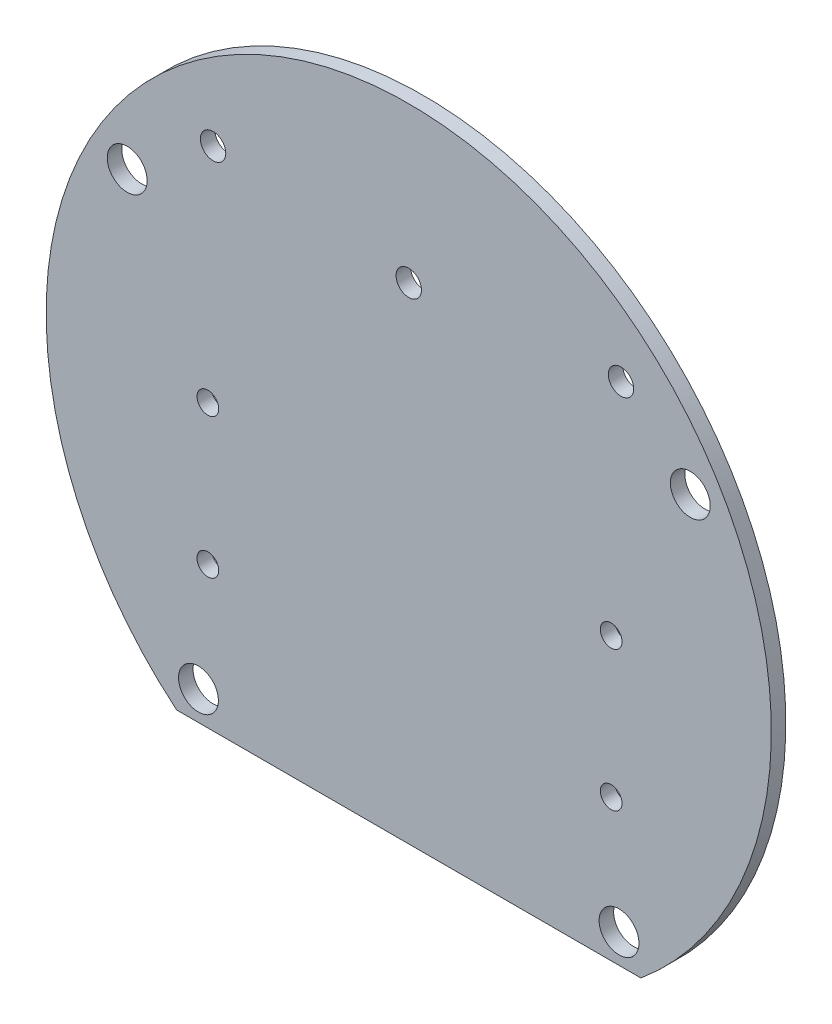
ISO-10303-21;
HEADER;
FILE_DESCRIPTION(('STEP AP214'),'2;1');
FILE_NAME('part.step','',(''),(''),'','','');
FILE_SCHEMA(('AUTOMOTIVE_DESIGN { 1 0 10303 214 1 1 1 1 }'));
ENDSEC;
DATA;
#1=APPLICATION_CONTEXT('core data for automotive mechanical design processes');
#2=APPLICATION_PROTOCOL_DEFINITION('international standard','automotive_design',2000,#1);
#3=PRODUCT_CONTEXT('',#1,'mechanical');
#4=PRODUCT('Part','Part','',(#3));
#5=PRODUCT_RELATED_PRODUCT_CATEGORY('part','',(#4));
#6=PRODUCT_DEFINITION_FORMATION('','',#4);
#7=PRODUCT_DEFINITION_CONTEXT('part definition',#1,'design');
#8=PRODUCT_DEFINITION('design','',#6,#7);
#9=PRODUCT_DEFINITION_SHAPE('','',#8);
#10=(LENGTH_UNIT() NAMED_UNIT(*) SI_UNIT(.MILLI.,.METRE.));
#11=(NAMED_UNIT(*) PLANE_ANGLE_UNIT() SI_UNIT($,.RADIAN.));
#12=(NAMED_UNIT(*) SI_UNIT($,.STERADIAN.) SOLID_ANGLE_UNIT());
#13=UNCERTAINTY_MEASURE_WITH_UNIT(LENGTH_MEASURE(1.E-05),#10,'distance_accuracy_value','');
#14=(GEOMETRIC_REPRESENTATION_CONTEXT(3) GLOBAL_UNCERTAINTY_ASSIGNED_CONTEXT((#13)) GLOBAL_UNIT_ASSIGNED_CONTEXT((#10,
#11,#12)) REPRESENTATION_CONTEXT('',''));
#15=CARTESIAN_POINT('',(0.,0.,0.));
#16=DIRECTION('',(0.,0.,1.));
#17=DIRECTION('',(1.,0.,0.));
#18=AXIS2_PLACEMENT_3D('',#15,#16,#17);
#19=CARTESIAN_POINT('',(0.,0.,2.));
#20=DIRECTION('',(0.,0.,-1.));
#21=DIRECTION('',(-1.,0.,0.));
#22=AXIS2_PLACEMENT_3D('',#19,#20,#21);
#23=CYLINDRICAL_SURFACE('',#22,50.);
#24=DIRECTION('',(0.,0.,-1.));
#25=VECTOR('',#24,1.);
#26=CARTESIAN_POINT('',(-32.0113353588168,-38.4093010681705,2.));
#27=LINE('',#26,#25);
#28=CARTESIAN_POINT('',(-32.0113353588168,-38.4093010681705,2.));
#29=VERTEX_POINT('',#28);
#30=CARTESIAN_POINT('',(-32.0113353588168,-38.4093010681705,0.));
#31=VERTEX_POINT('',#30);
#32=EDGE_CURVE('E55',#29,#31,#27,.T.);
#33=ORIENTED_EDGE('',*,*,#32,.F.);
#34=CARTESIAN_POINT('',(0.,0.,2.));
#35=DIRECTION('',(0.,0.,1.));
#36=DIRECTION('',(1.,0.,0.));
#37=AXIS2_PLACEMENT_3D('',#34,#35,#36);
#38=CIRCLE('',#37,50.);
#39=CARTESIAN_POINT('',(32.0113353588168,-38.4093010681705,2.));
#40=VERTEX_POINT('',#39);
#41=EDGE_CURVE('E49',#40,#29,#38,.T.);
#42=ORIENTED_EDGE('',*,*,#41,.F.);
#43=DIRECTION('',(0.,0.,-1.));
#44=VECTOR('',#43,1.);
#45=CARTESIAN_POINT('',(32.0113353588168,-38.4093010681705,2.));
#46=LINE('',#45,#44);
#47=CARTESIAN_POINT('',(32.0113353588168,-38.4093010681705,0.));
#48=VERTEX_POINT('',#47);
#49=EDGE_CURVE('E66',#48,#40,#46,.F.);
#50=ORIENTED_EDGE('',*,*,#49,.F.);
#51=CARTESIAN_POINT('',(0.,0.,0.));
#52=DIRECTION('',(0.,0.,1.));
#53=DIRECTION('',(1.,0.,0.));
#54=AXIS2_PLACEMENT_3D('',#51,#52,#53);
#55=CIRCLE('',#54,50.);
#56=EDGE_CURVE('E72',#48,#31,#55,.T.);
#57=ORIENTED_EDGE('',*,*,#56,.T.);
#58=EDGE_LOOP('',(#33,#42,#50,#57));
#59=FACE_BOUND('',#58,.T.);
#60=ADVANCED_FACE('F41',(#59),#23,.T.);
#61=CARTESIAN_POINT('',(0.,0.,2.));
#62=DIRECTION('',(0.,0.,1.));
#63=DIRECTION('',(1.,0.,0.));
#64=AXIS2_PLACEMENT_3D('',#61,#62,#63);
#65=PLANE('',#64);
#66=CARTESIAN_POINT('',(29.27,31.44,2.));
#67=DIRECTION('',(0.,0.,1.));
#68=DIRECTION('',(1.,0.,0.));
#69=AXIS2_PLACEMENT_3D('',#66,#67,#68);
#70=CIRCLE('',#69,1.75);
#71=CARTESIAN_POINT('',(31.02,31.44,2.));
#72=VERTEX_POINT('',#71);
#73=EDGE_CURVE('E75',#72,#72,#70,.T.);
#74=ORIENTED_EDGE('',*,*,#73,.F.);
#75=EDGE_LOOP('',(#74));
#76=FACE_BOUND('',#75,.T.);
#77=CARTESIAN_POINT('',(-26.98,31.44,2.));
#78=DIRECTION('',(0.,0.,1.));
#79=DIRECTION('',(1.,0.,0.));
#80=AXIS2_PLACEMENT_3D('',#77,#78,#79);
#81=CIRCLE('',#80,1.75);
#82=CARTESIAN_POINT('',(-25.23,31.44,2.));
#83=VERTEX_POINT('',#82);
#84=EDGE_CURVE('E121',#83,#83,#81,.T.);
#85=ORIENTED_EDGE('',*,*,#84,.F.);
#86=EDGE_LOOP('',(#85));
#87=FACE_BOUND('',#86,.T.);
#88=CARTESIAN_POINT('',(27.91,0.439999999999989,2.));
#89=DIRECTION('',(0.,0.,1.));
#90=DIRECTION('',(1.,0.,0.));
#91=AXIS2_PLACEMENT_3D('',#88,#89,#90);
#92=CIRCLE('',#91,1.5);
#93=CARTESIAN_POINT('',(29.41,0.439999999999989,2.));
#94=VERTEX_POINT('',#93);
#95=EDGE_CURVE('E125',#94,#94,#92,.T.);
#96=ORIENTED_EDGE('',*,*,#95,.F.);
#97=EDGE_LOOP('',(#96));
#98=FACE_BOUND('',#97,.T.);
#99=CARTESIAN_POINT('',(-27.7,0.439999999999996,2.));
#100=DIRECTION('',(0.,0.,1.));
#101=DIRECTION('',(1.,0.,0.));
#102=AXIS2_PLACEMENT_3D('',#99,#100,#101);
#103=CIRCLE('',#102,1.5);
#104=CARTESIAN_POINT('',(-26.2,0.439999999999996,2.));
#105=VERTEX_POINT('',#104);
#106=EDGE_CURVE('E129',#105,#105,#103,.T.);
#107=ORIENTED_EDGE('',*,*,#106,.F.);
#108=EDGE_LOOP('',(#107));
#109=FACE_BOUND('',#108,.T.);
#110=CARTESIAN_POINT('',(-27.7,-18.86,2.));
#111=DIRECTION('',(0.,0.,1.));
#112=DIRECTION('',(1.,0.,0.));
#113=AXIS2_PLACEMENT_3D('',#110,#111,#112);
#114=CIRCLE('',#113,1.5);
#115=CARTESIAN_POINT('',(-26.2,-18.86,2.));
#116=VERTEX_POINT('',#115);
#117=EDGE_CURVE('E133',#116,#116,#114,.T.);
#118=ORIENTED_EDGE('',*,*,#117,.F.);
#119=EDGE_LOOP('',(#118));
#120=FACE_BOUND('',#119,.T.);
#121=CARTESIAN_POINT('',(27.91,-18.86,2.));
#122=DIRECTION('',(0.,0.,1.));
#123=DIRECTION('',(1.,0.,0.));
#124=AXIS2_PLACEMENT_3D('',#121,#122,#123);
#125=CIRCLE('',#124,1.5);
#126=CARTESIAN_POINT('',(29.41,-18.86,2.));
#127=VERTEX_POINT('',#126);
#128=EDGE_CURVE('E137',#127,#127,#125,.T.);
#129=ORIENTED_EDGE('',*,*,#128,.F.);
#130=EDGE_LOOP('',(#129));
#131=FACE_BOUND('',#130,.T.);
#132=CARTESIAN_POINT('',(0.,28.6,2.));
#133=DIRECTION('',(0.,0.,1.));
#134=DIRECTION('',(1.,0.,0.));
#135=AXIS2_PLACEMENT_3D('',#132,#133,#134);
#136=CIRCLE('',#135,1.75);
#137=CARTESIAN_POINT('',(1.75,28.6,2.));
#138=VERTEX_POINT('',#137);
#139=EDGE_CURVE('E141',#138,#138,#136,.T.);
#140=ORIENTED_EDGE('',*,*,#139,.F.);
#141=EDGE_LOOP('',(#140));
#142=FACE_BOUND('',#141,.T.);
#143=CARTESIAN_POINT('',(38.8241975308642,22.7526193235952,2.));
#144=DIRECTION('',(0.,0.,1.));
#145=DIRECTION('',(1.,0.,0.));
#146=AXIS2_PLACEMENT_3D('',#143,#144,#145);
#147=CIRCLE('',#146,2.75);
#148=CARTESIAN_POINT('',(41.5741975308642,22.7526193235952,2.));
#149=VERTEX_POINT('',#148);
#150=EDGE_CURVE('E91',#149,#149,#147,.T.);
#151=ORIENTED_EDGE('',*,*,#150,.F.);
#152=EDGE_LOOP('',(#151));
#153=FACE_BOUND('',#152,.T.);
#154=CARTESIAN_POINT('',(-38.8241975308642,22.7526193235952,2.));
#155=DIRECTION('',(0.,0.,1.));
#156=DIRECTION('',(1.,0.,0.));
#157=AXIS2_PLACEMENT_3D('',#154,#155,#156);
#158=CIRCLE('',#157,2.75);
#159=CARTESIAN_POINT('',(-36.0741975308642,22.7526193235952,2.));
#160=VERTEX_POINT('',#159);
#161=EDGE_CURVE('E99',#160,#160,#158,.T.);
#162=ORIENTED_EDGE('',*,*,#161,.F.);
#163=EDGE_LOOP('',(#162));
#164=FACE_BOUND('',#163,.T.);
#165=CARTESIAN_POINT('',(29.,-34.4093010681705,2.));
#166=DIRECTION('',(0.,0.,1.));
#167=DIRECTION('',(1.,0.,0.));
#168=AXIS2_PLACEMENT_3D('',#165,#166,#167);
#169=CIRCLE('',#168,2.75);
#170=CARTESIAN_POINT('',(31.75,-34.4093010681705,2.));
#171=VERTEX_POINT('',#170);
#172=EDGE_CURVE('E107',#171,#171,#169,.T.);
#173=ORIENTED_EDGE('',*,*,#172,.F.);
#174=EDGE_LOOP('',(#173));
#175=FACE_BOUND('',#174,.T.);
#176=CARTESIAN_POINT('',(-29.,-34.4093010681705,2.));
#177=DIRECTION('',(0.,0.,1.));
#178=DIRECTION('',(1.,0.,0.));
#179=AXIS2_PLACEMENT_3D('',#176,#177,#178);
#180=CIRCLE('',#179,2.75);
#181=CARTESIAN_POINT('',(-26.25,-34.4093010681705,2.));
#182=VERTEX_POINT('',#181);
#183=EDGE_CURVE('E84',#182,#182,#180,.T.);
#184=ORIENTED_EDGE('',*,*,#183,.F.);
#185=EDGE_LOOP('',(#184));
#186=FACE_BOUND('',#185,.T.);
#187=ORIENTED_EDGE('',*,*,#41,.T.);
#188=DIRECTION('',(1.,0.,0.));
#189=VECTOR('',#188,1.);
#190=CARTESIAN_POINT('',(0.,-38.4093010681705,2.));
#191=LINE('',#190,#189);
#192=EDGE_CURVE('E60',#29,#40,#191,.T.);
#193=ORIENTED_EDGE('',*,*,#192,.T.);
#194=EDGE_LOOP('',(#187,#193));
#195=FACE_BOUND('',#194,.T.);
#196=ADVANCED_FACE('F179',(#76,#87,#98,#109,#120,#131,#142,#153,#164,#175,#186,#195),#65,.T.);
#197=CARTESIAN_POINT('',(0.,0.,0.));
#198=DIRECTION('',(0.,0.,1.));
#199=DIRECTION('',(1.,0.,0.));
#200=AXIS2_PLACEMENT_3D('',#197,#198,#199);
#201=PLANE('',#200);
#202=CARTESIAN_POINT('',(29.27,31.44,0.));
#203=DIRECTION('',(0.,0.,-1.));
#204=DIRECTION('',(-1.,0.,0.));
#205=AXIS2_PLACEMENT_3D('',#202,#203,#204);
#206=CIRCLE('',#205,1.75);
#207=CARTESIAN_POINT('',(27.52,31.44,0.));
#208=VERTEX_POINT('',#207);
#209=EDGE_CURVE('E150',#208,#208,#206,.T.);
#210=ORIENTED_EDGE('',*,*,#209,.F.);
#211=EDGE_LOOP('',(#210));
#212=FACE_BOUND('',#211,.T.);
#213=CARTESIAN_POINT('',(-26.98,31.44,0.));
#214=DIRECTION('',(0.,0.,-1.));
#215=DIRECTION('',(-1.,0.,0.));
#216=AXIS2_PLACEMENT_3D('',#213,#214,#215);
#217=CIRCLE('',#216,1.75);
#218=CARTESIAN_POINT('',(-28.73,31.44,0.));
#219=VERTEX_POINT('',#218);
#220=EDGE_CURVE('E154',#219,#219,#217,.T.);
#221=ORIENTED_EDGE('',*,*,#220,.F.);
#222=EDGE_LOOP('',(#221));
#223=FACE_BOUND('',#222,.T.);
#224=CARTESIAN_POINT('',(27.91,0.439999999999989,0.));
#225=DIRECTION('',(0.,0.,-1.));
#226=DIRECTION('',(-1.,0.,0.));
#227=AXIS2_PLACEMENT_3D('',#224,#225,#226);
#228=CIRCLE('',#227,1.5);
#229=CARTESIAN_POINT('',(26.41,0.439999999999989,0.));
#230=VERTEX_POINT('',#229);
#231=EDGE_CURVE('E158',#230,#230,#228,.T.);
#232=ORIENTED_EDGE('',*,*,#231,.F.);
#233=EDGE_LOOP('',(#232));
#234=FACE_BOUND('',#233,.T.);
#235=CARTESIAN_POINT('',(-27.7,0.439999999999996,0.));
#236=DIRECTION('',(0.,0.,-1.));
#237=DIRECTION('',(-1.,0.,0.));
#238=AXIS2_PLACEMENT_3D('',#235,#236,#237);
#239=CIRCLE('',#238,1.5);
#240=CARTESIAN_POINT('',(-29.2,0.439999999999996,0.));
#241=VERTEX_POINT('',#240);
#242=EDGE_CURVE('E162',#241,#241,#239,.T.);
#243=ORIENTED_EDGE('',*,*,#242,.F.);
#244=EDGE_LOOP('',(#243));
#245=FACE_BOUND('',#244,.T.);
#246=CARTESIAN_POINT('',(-27.7,-18.86,0.));
#247=DIRECTION('',(0.,0.,-1.));
#248=DIRECTION('',(-1.,0.,0.));
#249=AXIS2_PLACEMENT_3D('',#246,#247,#248);
#250=CIRCLE('',#249,1.5);
#251=CARTESIAN_POINT('',(-29.2,-18.86,0.));
#252=VERTEX_POINT('',#251);
#253=EDGE_CURVE('E166',#252,#252,#250,.T.);
#254=ORIENTED_EDGE('',*,*,#253,.F.);
#255=EDGE_LOOP('',(#254));
#256=FACE_BOUND('',#255,.T.);
#257=CARTESIAN_POINT('',(27.91,-18.86,0.));
#258=DIRECTION('',(0.,0.,-1.));
#259=DIRECTION('',(-1.,0.,0.));
#260=AXIS2_PLACEMENT_3D('',#257,#258,#259);
#261=CIRCLE('',#260,1.5);
#262=CARTESIAN_POINT('',(26.41,-18.86,0.));
#263=VERTEX_POINT('',#262);
#264=EDGE_CURVE('E149',#263,#263,#261,.T.);
#265=ORIENTED_EDGE('',*,*,#264,.F.);
#266=EDGE_LOOP('',(#265));
#267=FACE_BOUND('',#266,.T.);
#268=CARTESIAN_POINT('',(0.,28.6,0.));
#269=DIRECTION('',(0.,0.,-1.));
#270=DIRECTION('',(-1.,0.,0.));
#271=AXIS2_PLACEMENT_3D('',#268,#269,#270);
#272=CIRCLE('',#271,1.75);
#273=CARTESIAN_POINT('',(-1.75,28.6,0.));
#274=VERTEX_POINT('',#273);
#275=EDGE_CURVE('E145',#274,#274,#272,.T.);
#276=ORIENTED_EDGE('',*,*,#275,.F.);
#277=EDGE_LOOP('',(#276));
#278=FACE_BOUND('',#277,.T.);
#279=CARTESIAN_POINT('',(-29.,-34.4093010681705,0.));
#280=DIRECTION('',(0.,0.,1.));
#281=DIRECTION('',(1.,0.,0.));
#282=AXIS2_PLACEMENT_3D('',#279,#280,#281);
#283=CIRCLE('',#282,2.75);
#284=CARTESIAN_POINT('',(-26.25,-34.4093010681705,0.));
#285=VERTEX_POINT('',#284);
#286=EDGE_CURVE('E79',#285,#285,#283,.T.);
#287=ORIENTED_EDGE('',*,*,#286,.T.);
#288=EDGE_LOOP('',(#287));
#289=FACE_BOUND('',#288,.T.);
#290=CARTESIAN_POINT('',(29.,-34.4093010681705,0.));
#291=DIRECTION('',(0.,0.,1.));
#292=DIRECTION('',(1.,0.,0.));
#293=AXIS2_PLACEMENT_3D('',#290,#291,#292);
#294=CIRCLE('',#293,2.75);
#295=CARTESIAN_POINT('',(31.75,-34.4093010681705,0.));
#296=VERTEX_POINT('',#295);
#297=EDGE_CURVE('E89',#296,#296,#294,.T.);
#298=ORIENTED_EDGE('',*,*,#297,.T.);
#299=EDGE_LOOP('',(#298));
#300=FACE_BOUND('',#299,.T.);
#301=CARTESIAN_POINT('',(-38.8241975308642,22.7526193235952,0.));
#302=DIRECTION('',(0.,0.,1.));
#303=DIRECTION('',(1.,0.,0.));
#304=AXIS2_PLACEMENT_3D('',#301,#302,#303);
#305=CIRCLE('',#304,2.75);
#306=CARTESIAN_POINT('',(-36.0741975308642,22.7526193235952,0.));
#307=VERTEX_POINT('',#306);
#308=EDGE_CURVE('E103',#307,#307,#305,.T.);
#309=ORIENTED_EDGE('',*,*,#308,.T.);
#310=EDGE_LOOP('',(#309));
#311=FACE_BOUND('',#310,.T.);
#312=CARTESIAN_POINT('',(38.8241975308642,22.7526193235952,0.));
#313=DIRECTION('',(0.,0.,1.));
#314=DIRECTION('',(1.,0.,0.));
#315=AXIS2_PLACEMENT_3D('',#312,#313,#314);
#316=CIRCLE('',#315,2.75);
#317=CARTESIAN_POINT('',(41.5741975308642,22.7526193235952,0.));
#318=VERTEX_POINT('',#317);
#319=EDGE_CURVE('E95',#318,#318,#316,.T.);
#320=ORIENTED_EDGE('',*,*,#319,.T.);
#321=EDGE_LOOP('',(#320));
#322=FACE_BOUND('',#321,.T.);
#323=DIRECTION('',(1.,0.,0.));
#324=VECTOR('',#323,1.);
#325=CARTESIAN_POINT('',(0.,-38.4093010681705,0.));
#326=LINE('',#325,#324);
#327=EDGE_CURVE('E11',#31,#48,#326,.T.);
#328=ORIENTED_EDGE('',*,*,#327,.F.);
#329=ORIENTED_EDGE('',*,*,#56,.F.);
#330=EDGE_LOOP('',(#328,#329));
#331=FACE_BOUND('',#330,.T.);
#332=ADVANCED_FACE('F77',(#212,#223,#234,#245,#256,#267,#278,#289,#300,#311,#322,#331),#201,.F.);
#333=CARTESIAN_POINT('',(-29.,-34.4093010681705,0.));
#334=DIRECTION('',(0.,0.,1.));
#335=DIRECTION('',(1.,0.,0.));
#336=AXIS2_PLACEMENT_3D('',#333,#334,#335);
#337=CYLINDRICAL_SURFACE('',#336,2.75);
#338=ORIENTED_EDGE('',*,*,#286,.F.);
#339=EDGE_LOOP('',(#338));
#340=FACE_BOUND('',#339,.T.);
#341=ORIENTED_EDGE('',*,*,#183,.T.);
#342=EDGE_LOOP('',(#341));
#343=FACE_BOUND('',#342,.T.);
#344=ADVANCED_FACE('F178',(#340,#343),#337,.F.);
#345=CARTESIAN_POINT('',(29.,-34.4093010681705,0.));
#346=DIRECTION('',(0.,0.,1.));
#347=DIRECTION('',(1.,0.,0.));
#348=AXIS2_PLACEMENT_3D('',#345,#346,#347);
#349=CYLINDRICAL_SURFACE('',#348,2.75);
#350=ORIENTED_EDGE('',*,*,#297,.F.);
#351=EDGE_LOOP('',(#350));
#352=FACE_BOUND('',#351,.T.);
#353=ORIENTED_EDGE('',*,*,#172,.T.);
#354=EDGE_LOOP('',(#353));
#355=FACE_BOUND('',#354,.T.);
#356=ADVANCED_FACE('F210',(#352,#355),#349,.F.);
#357=CARTESIAN_POINT('',(-38.8241975308642,22.7526193235952,0.));
#358=DIRECTION('',(0.,0.,1.));
#359=DIRECTION('',(1.,0.,0.));
#360=AXIS2_PLACEMENT_3D('',#357,#358,#359);
#361=CYLINDRICAL_SURFACE('',#360,2.75);
#362=ORIENTED_EDGE('',*,*,#308,.F.);
#363=EDGE_LOOP('',(#362));
#364=FACE_BOUND('',#363,.T.);
#365=ORIENTED_EDGE('',*,*,#161,.T.);
#366=EDGE_LOOP('',(#365));
#367=FACE_BOUND('',#366,.T.);
#368=ADVANCED_FACE('F194',(#364,#367),#361,.F.);
#369=CARTESIAN_POINT('',(38.8241975308642,22.7526193235952,0.));
#370=DIRECTION('',(0.,0.,1.));
#371=DIRECTION('',(1.,0.,0.));
#372=AXIS2_PLACEMENT_3D('',#369,#370,#371);
#373=CYLINDRICAL_SURFACE('',#372,2.75);
#374=ORIENTED_EDGE('',*,*,#319,.F.);
#375=EDGE_LOOP('',(#374));
#376=FACE_BOUND('',#375,.T.);
#377=ORIENTED_EDGE('',*,*,#150,.T.);
#378=EDGE_LOOP('',(#377));
#379=FACE_BOUND('',#378,.T.);
#380=ADVANCED_FACE('F191',(#376,#379),#373,.F.);
#381=CARTESIAN_POINT('',(-40.7238599785686,-38.4093010681705,2.000012));
#382=DIRECTION('',(0.,-1.,0.));
#383=DIRECTION('',(0.,0.,-1.));
#384=AXIS2_PLACEMENT_3D('',#381,#382,#383);
#385=PLANE('',#384);
#386=ORIENTED_EDGE('',*,*,#32,.T.);
#387=ORIENTED_EDGE('',*,*,#327,.T.);
#388=ORIENTED_EDGE('',*,*,#49,.T.);
#389=ORIENTED_EDGE('',*,*,#192,.F.);
#390=EDGE_LOOP('',(#386,#387,#388,#389));
#391=FACE_BOUND('',#390,.T.);
#392=ADVANCED_FACE('F65',(#391),#385,.T.);
#393=CARTESIAN_POINT('',(0.,28.6,10.));
#394=DIRECTION('',(0.,0.,-1.));
#395=DIRECTION('',(-1.,0.,0.));
#396=AXIS2_PLACEMENT_3D('',#393,#394,#395);
#397=CYLINDRICAL_SURFACE('',#396,1.75);
#398=ORIENTED_EDGE('',*,*,#139,.T.);
#399=EDGE_LOOP('',(#398));
#400=FACE_BOUND('',#399,.T.);
#401=ORIENTED_EDGE('',*,*,#275,.T.);
#402=EDGE_LOOP('',(#401));
#403=FACE_BOUND('',#402,.T.);
#404=ADVANCED_FACE('F241',(#400,#403),#397,.F.);
#405=CARTESIAN_POINT('',(27.91,-18.86,10.));
#406=DIRECTION('',(0.,0.,-1.));
#407=DIRECTION('',(-1.,0.,0.));
#408=AXIS2_PLACEMENT_3D('',#405,#406,#407);
#409=CYLINDRICAL_SURFACE('',#408,1.5);
#410=ORIENTED_EDGE('',*,*,#128,.T.);
#411=EDGE_LOOP('',(#410));
#412=FACE_BOUND('',#411,.T.);
#413=ORIENTED_EDGE('',*,*,#264,.T.);
#414=EDGE_LOOP('',(#413));
#415=FACE_BOUND('',#414,.T.);
#416=ADVANCED_FACE('F174',(#412,#415),#409,.F.);
#417=CARTESIAN_POINT('',(-27.7,-18.86,10.));
#418=DIRECTION('',(0.,0.,-1.));
#419=DIRECTION('',(-1.,0.,0.));
#420=AXIS2_PLACEMENT_3D('',#417,#418,#419);
#421=CYLINDRICAL_SURFACE('',#420,1.5);
#422=ORIENTED_EDGE('',*,*,#117,.T.);
#423=EDGE_LOOP('',(#422));
#424=FACE_BOUND('',#423,.T.);
#425=ORIENTED_EDGE('',*,*,#253,.T.);
#426=EDGE_LOOP('',(#425));
#427=FACE_BOUND('',#426,.T.);
#428=ADVANCED_FACE('F257',(#424,#427),#421,.F.);
#429=CARTESIAN_POINT('',(-27.7,0.439999999999996,10.));
#430=DIRECTION('',(0.,0.,-1.));
#431=DIRECTION('',(-1.,0.,0.));
#432=AXIS2_PLACEMENT_3D('',#429,#430,#431);
#433=CYLINDRICAL_SURFACE('',#432,1.5);
#434=ORIENTED_EDGE('',*,*,#106,.T.);
#435=EDGE_LOOP('',(#434));
#436=FACE_BOUND('',#435,.T.);
#437=ORIENTED_EDGE('',*,*,#242,.T.);
#438=EDGE_LOOP('',(#437));
#439=FACE_BOUND('',#438,.T.);
#440=ADVANCED_FACE('F267',(#436,#439),#433,.F.);
#441=CARTESIAN_POINT('',(27.91,0.439999999999989,10.));
#442=DIRECTION('',(0.,0.,-1.));
#443=DIRECTION('',(-1.,0.,0.));
#444=AXIS2_PLACEMENT_3D('',#441,#442,#443);
#445=CYLINDRICAL_SURFACE('',#444,1.5);
#446=ORIENTED_EDGE('',*,*,#95,.T.);
#447=EDGE_LOOP('',(#446));
#448=FACE_BOUND('',#447,.T.);
#449=ORIENTED_EDGE('',*,*,#231,.T.);
#450=EDGE_LOOP('',(#449));
#451=FACE_BOUND('',#450,.T.);
#452=ADVANCED_FACE('F277',(#448,#451),#445,.F.);
#453=CARTESIAN_POINT('',(-26.98,31.44,10.));
#454=DIRECTION('',(0.,0.,-1.));
#455=DIRECTION('',(-1.,0.,0.));
#456=AXIS2_PLACEMENT_3D('',#453,#454,#455);
#457=CYLINDRICAL_SURFACE('',#456,1.75);
#458=ORIENTED_EDGE('',*,*,#84,.T.);
#459=EDGE_LOOP('',(#458));
#460=FACE_BOUND('',#459,.T.);
#461=ORIENTED_EDGE('',*,*,#220,.T.);
#462=EDGE_LOOP('',(#461));
#463=FACE_BOUND('',#462,.T.);
#464=ADVANCED_FACE('F287',(#460,#463),#457,.F.);
#465=CARTESIAN_POINT('',(29.27,31.44,10.));
#466=DIRECTION('',(0.,0.,-1.));
#467=DIRECTION('',(-1.,0.,0.));
#468=AXIS2_PLACEMENT_3D('',#465,#466,#467);
#469=CYLINDRICAL_SURFACE('',#468,1.75);
#470=ORIENTED_EDGE('',*,*,#73,.T.);
#471=EDGE_LOOP('',(#470));
#472=FACE_BOUND('',#471,.T.);
#473=ORIENTED_EDGE('',*,*,#209,.T.);
#474=EDGE_LOOP('',(#473));
#475=FACE_BOUND('',#474,.T.);
#476=ADVANCED_FACE('F297',(#472,#475),#469,.F.);
#477=CLOSED_SHELL('',(#60,#196,#332,#344,#356,#368,#380,#392,#404,#416,#428,#440,#452,#464,#476));
#478=MANIFOLD_SOLID_BREP('B2',#477);
#479=ADVANCED_BREP_SHAPE_REPRESENTATION('',(#18,#478),#14);
#480=SHAPE_DEFINITION_REPRESENTATION(#9,#479);
ENDSEC;
END-ISO-10303-21;
